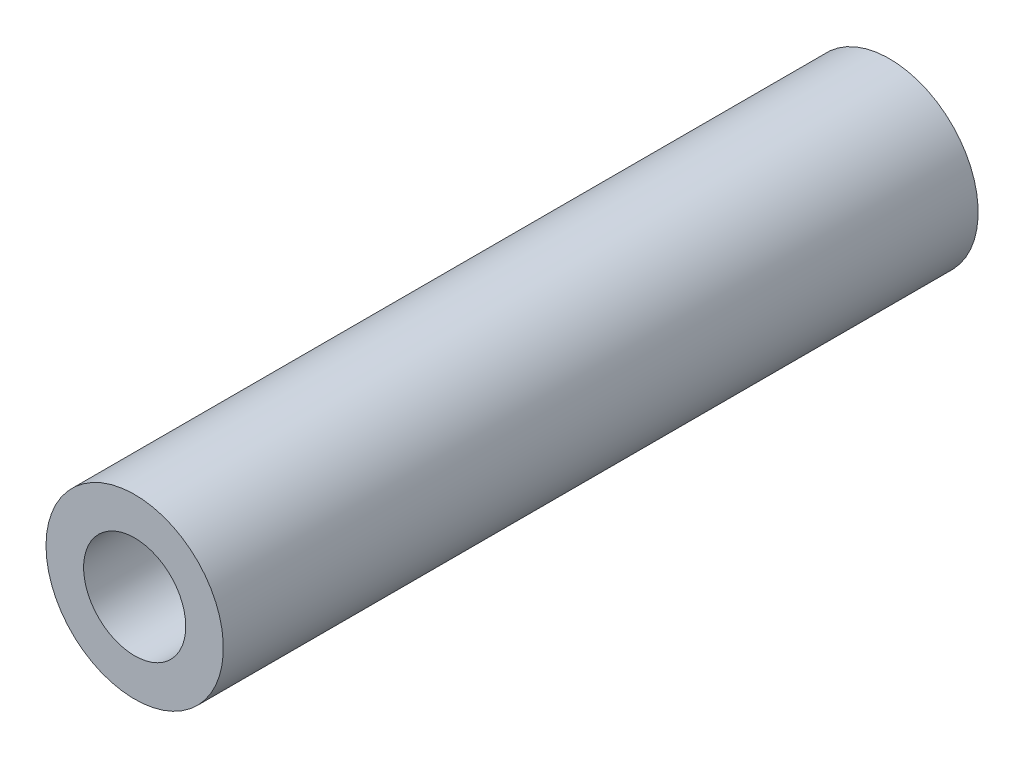
ISO-10303-21;
HEADER;
FILE_DESCRIPTION(('STEP AP214'),'2;1');
FILE_NAME('part.step','',(''),(''),'','','');
FILE_SCHEMA(('AUTOMOTIVE_DESIGN { 1 0 10303 214 1 1 1 1 }'));
ENDSEC;
DATA;
#1=APPLICATION_CONTEXT('core data for automotive mechanical design processes');
#2=APPLICATION_PROTOCOL_DEFINITION('international standard','automotive_design',2000,#1);
#3=PRODUCT_CONTEXT('',#1,'mechanical');
#4=PRODUCT('Part','Part','',(#3));
#5=PRODUCT_RELATED_PRODUCT_CATEGORY('part','',(#4));
#6=PRODUCT_DEFINITION_FORMATION('','',#4);
#7=PRODUCT_DEFINITION_CONTEXT('part definition',#1,'design');
#8=PRODUCT_DEFINITION('design','',#6,#7);
#9=PRODUCT_DEFINITION_SHAPE('','',#8);
#10=(LENGTH_UNIT() NAMED_UNIT(*) SI_UNIT(.MILLI.,.METRE.));
#11=(NAMED_UNIT(*) PLANE_ANGLE_UNIT() SI_UNIT($,.RADIAN.));
#12=(NAMED_UNIT(*) SI_UNIT($,.STERADIAN.) SOLID_ANGLE_UNIT());
#13=UNCERTAINTY_MEASURE_WITH_UNIT(LENGTH_MEASURE(1.E-05),#10,'distance_accuracy_value','');
#14=(GEOMETRIC_REPRESENTATION_CONTEXT(3) GLOBAL_UNCERTAINTY_ASSIGNED_CONTEXT((#13)) GLOBAL_UNIT_ASSIGNED_CONTEXT((#10,
#11,#12)) REPRESENTATION_CONTEXT('',''));
#15=CARTESIAN_POINT('',(0.,0.,0.));
#16=DIRECTION('',(0.,0.,1.));
#17=DIRECTION('',(1.,0.,0.));
#18=AXIS2_PLACEMENT_3D('',#15,#16,#17);
#19=CARTESIAN_POINT('',(0.,0.,-2.17425989083544));
#20=DIRECTION('',(0.,0.,1.));
#21=DIRECTION('',(1.,0.,0.));
#22=AXIS2_PLACEMENT_3D('',#19,#20,#21);
#23=CYLINDRICAL_SURFACE('',#22,2.7432);
#24=CARTESIAN_POINT('',(0.,0.,0.));
#25=DIRECTION('',(0.,0.,1.));
#26=DIRECTION('',(1.,0.,0.));
#27=AXIS2_PLACEMENT_3D('',#24,#25,#26);
#28=CIRCLE('',#27,2.7432);
#29=CARTESIAN_POINT('',(2.74320000000001,0.,0.));
#30=VERTEX_POINT('',#29);
#31=EDGE_CURVE('E18',#30,#30,#28,.T.);
#32=ORIENTED_EDGE('',*,*,#31,.F.);
#33=EDGE_LOOP('',(#32));
#34=FACE_BOUND('',#33,.T.);
#35=CARTESIAN_POINT('',(0.,0.,40.54));
#36=DIRECTION('',(0.,0.,1.));
#37=DIRECTION('',(1.,0.,0.));
#38=AXIS2_PLACEMENT_3D('',#35,#36,#37);
#39=CIRCLE('',#38,2.7432);
#40=CARTESIAN_POINT('',(2.74320000000001,0.,40.54));
#41=VERTEX_POINT('',#40);
#42=EDGE_CURVE('E27',#41,#41,#39,.F.);
#43=ORIENTED_EDGE('',*,*,#42,.F.);
#44=EDGE_LOOP('',(#43));
#45=FACE_BOUND('',#44,.T.);
#46=ADVANCED_FACE('F15',(#34,#45),#23,.F.);
#47=CARTESIAN_POINT('',(0.,0.,0.));
#48=DIRECTION('',(0.,0.,-1.));
#49=DIRECTION('',(-1.,0.,0.));
#50=AXIS2_PLACEMENT_3D('',#47,#48,#49);
#51=PLANE('',#50);
#52=CARTESIAN_POINT('',(0.,0.,0.));
#53=DIRECTION('',(0.,0.,-1.));
#54=DIRECTION('',(-1.,0.,0.));
#55=AXIS2_PLACEMENT_3D('',#52,#53,#54);
#56=CIRCLE('',#55,4.7625);
#57=CARTESIAN_POINT('',(-4.76249999999999,0.,0.));
#58=VERTEX_POINT('',#57);
#59=EDGE_CURVE('E22',#58,#58,#56,.F.);
#60=ORIENTED_EDGE('',*,*,#59,.F.);
#61=EDGE_LOOP('',(#60));
#62=FACE_BOUND('',#61,.T.);
#63=ORIENTED_EDGE('',*,*,#31,.T.);
#64=EDGE_LOOP('',(#63));
#65=FACE_BOUND('',#64,.T.);
#66=ADVANCED_FACE('F35',(#62,#65),#51,.T.);
#67=CARTESIAN_POINT('',(0.,0.,40.54));
#68=DIRECTION('',(0.,0.,1.));
#69=DIRECTION('',(1.,0.,0.));
#70=AXIS2_PLACEMENT_3D('',#67,#68,#69);
#71=PLANE('',#70);
#72=CARTESIAN_POINT('',(0.,0.,40.54));
#73=DIRECTION('',(0.,0.,-1.));
#74=DIRECTION('',(-1.,0.,0.));
#75=AXIS2_PLACEMENT_3D('',#72,#73,#74);
#76=CIRCLE('',#75,4.7625);
#77=CARTESIAN_POINT('',(-4.76249999999999,0.,40.54));
#78=VERTEX_POINT('',#77);
#79=EDGE_CURVE('E10',#78,#78,#76,.T.);
#80=ORIENTED_EDGE('',*,*,#79,.F.);
#81=EDGE_LOOP('',(#80));
#82=FACE_BOUND('',#81,.T.);
#83=ORIENTED_EDGE('',*,*,#42,.T.);
#84=EDGE_LOOP('',(#83));
#85=FACE_BOUND('',#84,.T.);
#86=ADVANCED_FACE('F43',(#82,#85),#71,.T.);
#87=CARTESIAN_POINT('',(0.,0.,40.64));
#88=DIRECTION('',(0.,0.,-1.));
#89=DIRECTION('',(-1.,0.,0.));
#90=AXIS2_PLACEMENT_3D('',#87,#88,#89);
#91=CYLINDRICAL_SURFACE('',#90,4.7625);
#92=ORIENTED_EDGE('',*,*,#79,.T.);
#93=EDGE_LOOP('',(#92));
#94=FACE_BOUND('',#93,.T.);
#95=ORIENTED_EDGE('',*,*,#59,.T.);
#96=EDGE_LOOP('',(#95));
#97=FACE_BOUND('',#96,.T.);
#98=ADVANCED_FACE('F45',(#94,#97),#91,.T.);
#99=CLOSED_SHELL('',(#46,#66,#86,#98));
#100=MANIFOLD_SOLID_BREP('B1',#99);
#101=ADVANCED_BREP_SHAPE_REPRESENTATION('',(#18,#100),#14);
#102=SHAPE_DEFINITION_REPRESENTATION(#9,#101);
ENDSEC;
END-ISO-10303-21;
